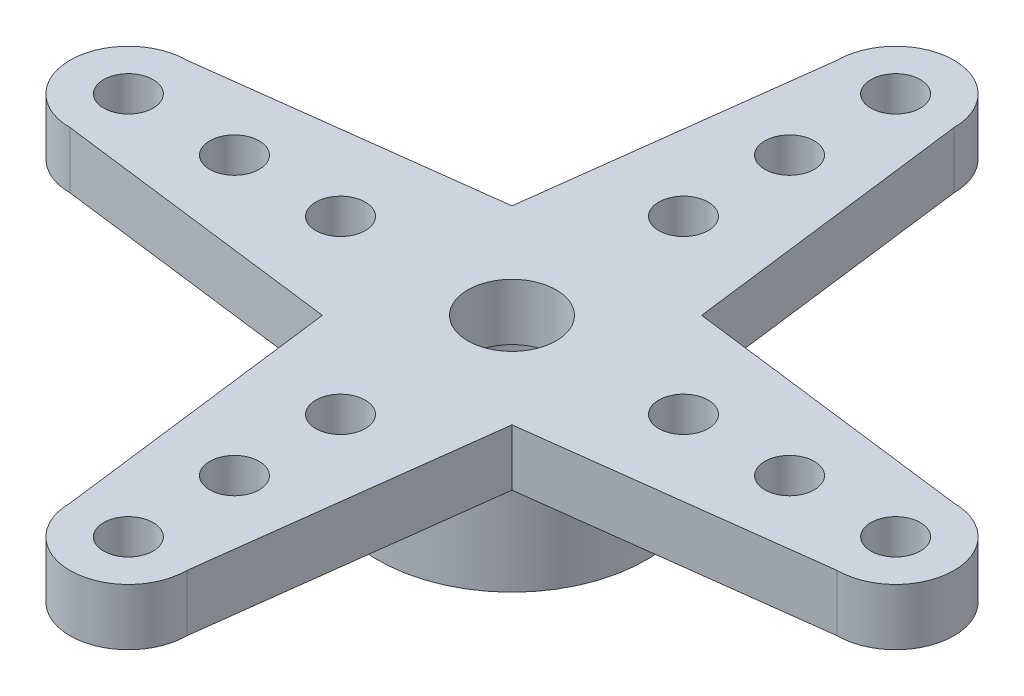
ISO-10303-21;
HEADER;
FILE_DESCRIPTION(('STEP AP214'),'2;1');
FILE_NAME('part.step','',(''),(''),'','','');
FILE_SCHEMA(('AUTOMOTIVE_DESIGN { 1 0 10303 214 1 1 1 1 }'));
ENDSEC;
DATA;
#1=APPLICATION_CONTEXT('core data for automotive mechanical design processes');
#2=APPLICATION_PROTOCOL_DEFINITION('international standard','automotive_design',2000,#1);
#3=PRODUCT_CONTEXT('',#1,'mechanical');
#4=PRODUCT('Part','Part','',(#3));
#5=PRODUCT_RELATED_PRODUCT_CATEGORY('part','',(#4));
#6=PRODUCT_DEFINITION_FORMATION('','',#4);
#7=PRODUCT_DEFINITION_CONTEXT('part definition',#1,'design');
#8=PRODUCT_DEFINITION('design','',#6,#7);
#9=PRODUCT_DEFINITION_SHAPE('','',#8);
#10=(LENGTH_UNIT() NAMED_UNIT(*) SI_UNIT(.MILLI.,.METRE.));
#11=(NAMED_UNIT(*) PLANE_ANGLE_UNIT() SI_UNIT($,.RADIAN.));
#12=(NAMED_UNIT(*) SI_UNIT($,.STERADIAN.) SOLID_ANGLE_UNIT());
#13=UNCERTAINTY_MEASURE_WITH_UNIT(LENGTH_MEASURE(1.E-05),#10,'distance_accuracy_value','');
#14=(GEOMETRIC_REPRESENTATION_CONTEXT(3) GLOBAL_UNCERTAINTY_ASSIGNED_CONTEXT((#13)) GLOBAL_UNIT_ASSIGNED_CONTEXT((#10,
#11,#12)) REPRESENTATION_CONTEXT('',''));
#15=CARTESIAN_POINT('',(0.,0.,0.));
#16=DIRECTION('',(0.,0.,1.));
#17=DIRECTION('',(1.,0.,0.));
#18=AXIS2_PLACEMENT_3D('',#15,#16,#17);
#19=CARTESIAN_POINT('',(-10.849696243319,0.,0.));
#20=DIRECTION('',(0.,-1.,0.));
#21=DIRECTION('',(0.,0.,-1.));
#22=AXIS2_PLACEMENT_3D('',#19,#20,#21);
#23=PLANE('',#22);
#24=CARTESIAN_POINT('',(0.,0.,0.));
#25=DIRECTION('',(0.,-1.,0.));
#26=DIRECTION('',(0.,0.,-1.));
#27=AXIS2_PLACEMENT_3D('',#24,#25,#26);
#28=CIRCLE('',#27,3.79284044463943);
#29=CARTESIAN_POINT('',(2.68194319836314,0.,-2.68194319836314));
#30=VERTEX_POINT('',#29);
#31=CARTESIAN_POINT('',(2.68194319836314,0.,2.68194319836314));
#32=VERTEX_POINT('',#31);
#33=EDGE_CURVE('E54',#30,#32,#28,.T.);
#34=ORIENTED_EDGE('',*,*,#33,.F.);
#35=DIRECTION('',(-0.99211277764572,0.,-0.125348460030807));
#36=VECTOR('',#35,1.);
#37=CARTESIAN_POINT('',(10.8472171800828,0.,-1.65030189467291));
#38=LINE('',#37,#36);
#39=CARTESIAN_POINT('',(10.8472171800828,0.,-1.65030189467291));
#40=VERTEX_POINT('',#39);
#41=EDGE_CURVE('E200',#40,#30,#38,.T.);
#42=ORIENTED_EDGE('',*,*,#41,.F.);
#43=CARTESIAN_POINT('',(10.849696243319,0.,0.));
#44=DIRECTION('',(0.,1.,0.));
#45=DIRECTION('',(0.,0.,1.));
#46=AXIS2_PLACEMENT_3D('',#43,#44,#45);
#47=CIRCLE('',#46,1.65030375668103);
#48=CARTESIAN_POINT('',(10.8472171800828,0.,1.65030189467291));
#49=VERTEX_POINT('',#48);
#50=EDGE_CURVE('E197',#49,#40,#47,.T.);
#51=ORIENTED_EDGE('',*,*,#50,.F.);
#52=DIRECTION('',(0.99211277764572,0.,-0.125348460030806));
#53=VECTOR('',#52,1.);
#54=CARTESIAN_POINT('',(2.68194319836314,0.,2.68194319836314));
#55=LINE('',#54,#53);
#56=EDGE_CURVE('E194',#32,#49,#55,.T.);
#57=ORIENTED_EDGE('',*,*,#56,.F.);
#58=EDGE_LOOP('',(#34,#42,#51,#57));
#59=FACE_BOUND('',#58,.T.);
#60=CARTESIAN_POINT('',(4.84969624331897,0.,0.));
#61=DIRECTION('',(0.,1.,0.));
#62=DIRECTION('',(0.,0.,-1.));
#63=AXIS2_PLACEMENT_3D('',#60,#61,#62);
#64=CIRCLE('',#63,0.7);
#65=CARTESIAN_POINT('',(4.84969624331897,0.,-0.700000000000001));
#66=VERTEX_POINT('',#65);
#67=EDGE_CURVE('E331',#66,#66,#64,.T.);
#68=ORIENTED_EDGE('',*,*,#67,.T.);
#69=EDGE_LOOP('',(#68));
#70=FACE_BOUND('',#69,.T.);
#71=CARTESIAN_POINT('',(10.849696243319,0.,0.));
#72=DIRECTION('',(0.,1.,0.));
#73=DIRECTION('',(0.,0.,-1.));
#74=AXIS2_PLACEMENT_3D('',#71,#72,#73);
#75=CIRCLE('',#74,0.7);
#76=CARTESIAN_POINT('',(10.849696243319,0.,-0.7));
#77=VERTEX_POINT('',#76);
#78=EDGE_CURVE('E363',#77,#77,#75,.T.);
#79=ORIENTED_EDGE('',*,*,#78,.T.);
#80=EDGE_LOOP('',(#79));
#81=FACE_BOUND('',#80,.T.);
#82=CARTESIAN_POINT('',(7.84969624331897,0.,0.));
#83=DIRECTION('',(0.,1.,0.));
#84=DIRECTION('',(0.,0.,-1.));
#85=AXIS2_PLACEMENT_3D('',#82,#83,#84);
#86=CIRCLE('',#85,0.7);
#87=CARTESIAN_POINT('',(7.84969624331897,0.,-0.700000000000001));
#88=VERTEX_POINT('',#87);
#89=EDGE_CURVE('E325',#88,#88,#86,.T.);
#90=ORIENTED_EDGE('',*,*,#89,.T.);
#91=EDGE_LOOP('',(#90));
#92=FACE_BOUND('',#91,.T.);
#93=ADVANCED_FACE('F41',(#59,#70,#81,#92),#23,.T.);
#94=CARTESIAN_POINT('',(-2.68194319836314,0.,2.68194319836314));
#95=VERTEX_POINT('',#94);
#96=EDGE_CURVE('E11',#32,#95,#28,.T.);
#97=ORIENTED_EDGE('',*,*,#96,.F.);
#98=DIRECTION('',(0.125348460030806,0.,-0.99211277764572));
#99=VECTOR('',#98,1.);
#100=CARTESIAN_POINT('',(1.65030189467291,0.,10.8472171800828));
#101=LINE('',#100,#99);
#102=CARTESIAN_POINT('',(1.65030189467291,0.,10.8472171800828));
#103=VERTEX_POINT('',#102);
#104=EDGE_CURVE('E190',#103,#32,#101,.T.);
#105=ORIENTED_EDGE('',*,*,#104,.F.);
#106=CARTESIAN_POINT('',(0.,0.,10.849696243319));
#107=DIRECTION('',(0.,1.,0.));
#108=DIRECTION('',(0.,0.,1.));
#109=AXIS2_PLACEMENT_3D('',#106,#107,#108);
#110=CIRCLE('',#109,1.65030375668103);
#111=CARTESIAN_POINT('',(-1.65030189467291,0.,10.8472171800828));
#112=VERTEX_POINT('',#111);
#113=EDGE_CURVE('E187',#112,#103,#110,.T.);
#114=ORIENTED_EDGE('',*,*,#113,.F.);
#115=DIRECTION('',(0.125348460030806,0.,0.99211277764572));
#116=VECTOR('',#115,1.);
#117=CARTESIAN_POINT('',(-2.68194319836314,0.,2.68194319836314));
#118=LINE('',#117,#116);
#119=EDGE_CURVE('E184',#95,#112,#118,.T.);
#120=ORIENTED_EDGE('',*,*,#119,.F.);
#121=EDGE_LOOP('',(#97,#105,#114,#120));
#122=FACE_BOUND('',#121,.T.);
#123=CARTESIAN_POINT('',(0.,0.,7.84969624331897));
#124=DIRECTION('',(0.,1.,0.));
#125=DIRECTION('',(0.,0.,-1.));
#126=AXIS2_PLACEMENT_3D('',#123,#124,#125);
#127=CIRCLE('',#126,0.7);
#128=CARTESIAN_POINT('',(0.,0.,7.14969624331897));
#129=VERTEX_POINT('',#128);
#130=EDGE_CURVE('E387',#129,#129,#127,.T.);
#131=ORIENTED_EDGE('',*,*,#130,.T.);
#132=EDGE_LOOP('',(#131));
#133=FACE_BOUND('',#132,.T.);
#134=CARTESIAN_POINT('',(0.,0.,4.84969624331897));
#135=DIRECTION('',(0.,1.,0.));
#136=DIRECTION('',(0.,0.,-1.));
#137=AXIS2_PLACEMENT_3D('',#134,#135,#136);
#138=CIRCLE('',#137,0.7);
#139=CARTESIAN_POINT('',(0.,0.,4.14969624331897));
#140=VERTEX_POINT('',#139);
#141=EDGE_CURVE('E395',#140,#140,#138,.T.);
#142=ORIENTED_EDGE('',*,*,#141,.T.);
#143=EDGE_LOOP('',(#142));
#144=FACE_BOUND('',#143,.T.);
#145=CARTESIAN_POINT('',(0.,0.,10.849696243319));
#146=DIRECTION('',(0.,1.,0.));
#147=DIRECTION('',(0.,0.,-1.));
#148=AXIS2_PLACEMENT_3D('',#145,#146,#147);
#149=CIRCLE('',#148,0.7);
#150=CARTESIAN_POINT('',(0.,0.,10.149696243319));
#151=VERTEX_POINT('',#150);
#152=EDGE_CURVE('E379',#151,#151,#149,.T.);
#153=ORIENTED_EDGE('',*,*,#152,.T.);
#154=EDGE_LOOP('',(#153));
#155=FACE_BOUND('',#154,.T.);
#156=ADVANCED_FACE('F291',(#122,#133,#144,#155),#23,.T.);
#157=CARTESIAN_POINT('',(-2.68194319836314,0.,-2.68194319836314));
#158=VERTEX_POINT('',#157);
#159=EDGE_CURVE('E52',#95,#158,#28,.T.);
#160=ORIENTED_EDGE('',*,*,#159,.F.);
#161=DIRECTION('',(0.99211277764572,0.,0.125348460030806));
#162=VECTOR('',#161,1.);
#163=CARTESIAN_POINT('',(-10.8472171800828,0.,1.65030189467291));
#164=LINE('',#163,#162);
#165=CARTESIAN_POINT('',(-10.8472171800828,0.,1.65030189467291));
#166=VERTEX_POINT('',#165);
#167=EDGE_CURVE('E179',#166,#95,#164,.T.);
#168=ORIENTED_EDGE('',*,*,#167,.F.);
#169=CARTESIAN_POINT('',(-10.849696243319,0.,0.));
#170=DIRECTION('',(0.,1.,0.));
#171=DIRECTION('',(0.,0.,-1.));
#172=AXIS2_PLACEMENT_3D('',#169,#170,#171);
#173=CIRCLE('',#172,1.65030375668103);
#174=CARTESIAN_POINT('',(-10.8472171800828,0.,-1.65030189467291));
#175=VERTEX_POINT('',#174);
#176=EDGE_CURVE('E175',#175,#166,#173,.T.);
#177=ORIENTED_EDGE('',*,*,#176,.F.);
#178=DIRECTION('',(-0.99211277764572,0.,0.125348460030806));
#179=VECTOR('',#178,1.);
#180=CARTESIAN_POINT('',(-2.68194319836314,0.,-2.68194319836314));
#181=LINE('',#180,#179);
#182=EDGE_CURVE('E108',#158,#175,#181,.T.);
#183=ORIENTED_EDGE('',*,*,#182,.F.);
#184=EDGE_LOOP('',(#160,#168,#177,#183));
#185=FACE_BOUND('',#184,.T.);
#186=CARTESIAN_POINT('',(-7.84969624331897,0.,0.));
#187=DIRECTION('',(0.,1.,0.));
#188=DIRECTION('',(0.,0.,1.));
#189=AXIS2_PLACEMENT_3D('',#186,#187,#188);
#190=CIRCLE('',#189,0.699999999999999);
#191=CARTESIAN_POINT('',(-7.84969624331897,0.,0.699999999999998));
#192=VERTEX_POINT('',#191);
#193=EDGE_CURVE('E347',#192,#192,#190,.T.);
#194=ORIENTED_EDGE('',*,*,#193,.T.);
#195=EDGE_LOOP('',(#194));
#196=FACE_BOUND('',#195,.T.);
#197=CARTESIAN_POINT('',(-10.849696243319,0.,0.));
#198=DIRECTION('',(0.,1.,0.));
#199=DIRECTION('',(0.,0.,1.));
#200=AXIS2_PLACEMENT_3D('',#197,#198,#199);
#201=CIRCLE('',#200,0.7);
#202=CARTESIAN_POINT('',(-10.849696243319,0.,0.699999999999999));
#203=VERTEX_POINT('',#202);
#204=EDGE_CURVE('E371',#203,#203,#201,.T.);
#205=ORIENTED_EDGE('',*,*,#204,.T.);
#206=EDGE_LOOP('',(#205));
#207=FACE_BOUND('',#206,.T.);
#208=CARTESIAN_POINT('',(-4.84969624331897,0.,0.));
#209=DIRECTION('',(0.,1.,0.));
#210=DIRECTION('',(0.,0.,1.));
#211=AXIS2_PLACEMENT_3D('',#208,#209,#210);
#212=CIRCLE('',#211,0.7);
#213=CARTESIAN_POINT('',(-4.84969624331897,0.,0.699999999999998));
#214=VERTEX_POINT('',#213);
#215=EDGE_CURVE('E339',#214,#214,#212,.T.);
#216=ORIENTED_EDGE('',*,*,#215,.T.);
#217=EDGE_LOOP('',(#216));
#218=FACE_BOUND('',#217,.T.);
#219=ADVANCED_FACE('F298',(#185,#196,#207,#218),#23,.T.);
#220=CARTESIAN_POINT('',(0.,0.,0.));
#221=DIRECTION('',(0.,1.,0.));
#222=DIRECTION('',(0.,0.,1.));
#223=AXIS2_PLACEMENT_3D('',#220,#221,#222);
#224=CIRCLE('',#223,1.25);
#225=CARTESIAN_POINT('',(0.,0.,1.25));
#226=VERTEX_POINT('',#225);
#227=EDGE_CURVE('E266',#226,#226,#224,.T.);
#228=ORIENTED_EDGE('',*,*,#227,.T.);
#229=EDGE_LOOP('',(#228));
#230=FACE_BOUND('',#229,.T.);
#231=CARTESIAN_POINT('',(0.,0.,0.));
#232=DIRECTION('',(0.,-1.,0.));
#233=DIRECTION('',(0.,0.,-1.));
#234=AXIS2_PLACEMENT_3D('',#231,#232,#233);
#235=CIRCLE('',#234,2.43);
#236=CARTESIAN_POINT('',(0.,0.,-2.43));
#237=VERTEX_POINT('',#236);
#238=EDGE_CURVE('E268',#237,#237,#235,.T.);
#239=ORIENTED_EDGE('',*,*,#238,.T.);
#240=EDGE_LOOP('',(#239));
#241=FACE_BOUND('',#240,.T.);
#242=ADVANCED_FACE('F277',(#230,#241),#23,.T.);
#243=CARTESIAN_POINT('',(-10.849696243319,1.6,0.));
#244=DIRECTION('',(0.,-1.,0.));
#245=DIRECTION('',(0.,0.,-1.));
#246=AXIS2_PLACEMENT_3D('',#243,#244,#245);
#247=PLANE('',#246);
#248=CARTESIAN_POINT('',(-10.849696243319,1.6,0.));
#249=DIRECTION('',(0.,1.,0.));
#250=DIRECTION('',(0.,0.,-1.));
#251=AXIS2_PLACEMENT_3D('',#248,#249,#250);
#252=CIRCLE('',#251,1.65030375668103);
#253=CARTESIAN_POINT('',(-10.8472171800828,1.6,-1.65030189467291));
#254=VERTEX_POINT('',#253);
#255=CARTESIAN_POINT('',(-10.8472171800828,1.6,1.65030189467291));
#256=VERTEX_POINT('',#255);
#257=EDGE_CURVE('E214',#254,#256,#252,.T.);
#258=ORIENTED_EDGE('',*,*,#257,.T.);
#259=DIRECTION('',(0.99211277764572,0.,0.125348460030806));
#260=VECTOR('',#259,1.);
#261=CARTESIAN_POINT('',(-10.8472171800828,1.6,1.65030189467291));
#262=LINE('',#261,#260);
#263=CARTESIAN_POINT('',(-2.68194319836314,1.6,2.68194319836314));
#264=VERTEX_POINT('',#263);
#265=EDGE_CURVE('E117',#256,#264,#262,.T.);
#266=ORIENTED_EDGE('',*,*,#265,.T.);
#267=DIRECTION('',(0.125348460030806,0.,0.99211277764572));
#268=VECTOR('',#267,1.);
#269=CARTESIAN_POINT('',(-2.68194319836314,1.6,2.68194319836314));
#270=LINE('',#269,#268);
#271=CARTESIAN_POINT('',(-1.65030189467291,1.6,10.8472171800828));
#272=VERTEX_POINT('',#271);
#273=EDGE_CURVE('E425',#264,#272,#270,.T.);
#274=ORIENTED_EDGE('',*,*,#273,.T.);
#275=CARTESIAN_POINT('',(0.,1.6,10.849696243319));
#276=DIRECTION('',(0.,1.,0.));
#277=DIRECTION('',(0.,0.,1.));
#278=AXIS2_PLACEMENT_3D('',#275,#276,#277);
#279=CIRCLE('',#278,1.65030375668103);
#280=CARTESIAN_POINT('',(1.65030189467291,1.6,10.8472171800828));
#281=VERTEX_POINT('',#280);
#282=EDGE_CURVE('E428',#272,#281,#279,.T.);
#283=ORIENTED_EDGE('',*,*,#282,.T.);
#284=DIRECTION('',(0.125348460030806,0.,-0.99211277764572));
#285=VECTOR('',#284,1.);
#286=CARTESIAN_POINT('',(1.65030189467291,1.6,10.8472171800828));
#287=LINE('',#286,#285);
#288=CARTESIAN_POINT('',(2.68194319836314,1.6,2.68194319836314));
#289=VERTEX_POINT('',#288);
#290=EDGE_CURVE('E431',#281,#289,#287,.T.);
#291=ORIENTED_EDGE('',*,*,#290,.T.);
#292=DIRECTION('',(0.99211277764572,0.,-0.125348460030806));
#293=VECTOR('',#292,1.);
#294=CARTESIAN_POINT('',(2.68194319836314,1.6,2.68194319836314));
#295=LINE('',#294,#293);
#296=CARTESIAN_POINT('',(10.8472171800828,1.6,1.65030189467291));
#297=VERTEX_POINT('',#296);
#298=EDGE_CURVE('E434',#289,#297,#295,.T.);
#299=ORIENTED_EDGE('',*,*,#298,.T.);
#300=CARTESIAN_POINT('',(10.849696243319,1.6,0.));
#301=DIRECTION('',(0.,1.,0.));
#302=DIRECTION('',(0.,0.,1.));
#303=AXIS2_PLACEMENT_3D('',#300,#301,#302);
#304=CIRCLE('',#303,1.65030375668103);
#305=CARTESIAN_POINT('',(10.8472171800828,1.6,-1.65030189467291));
#306=VERTEX_POINT('',#305);
#307=EDGE_CURVE('E437',#297,#306,#304,.T.);
#308=ORIENTED_EDGE('',*,*,#307,.T.);
#309=DIRECTION('',(-0.99211277764572,0.,-0.125348460030807));
#310=VECTOR('',#309,1.);
#311=CARTESIAN_POINT('',(10.8472171800828,1.6,-1.65030189467291));
#312=LINE('',#311,#310);
#313=CARTESIAN_POINT('',(2.68194319836314,1.6,-2.68194319836314));
#314=VERTEX_POINT('',#313);
#315=EDGE_CURVE('E440',#306,#314,#312,.T.);
#316=ORIENTED_EDGE('',*,*,#315,.T.);
#317=DIRECTION('',(-0.125348460030806,0.,-0.99211277764572));
#318=VECTOR('',#317,1.);
#319=CARTESIAN_POINT('',(2.68194319836314,1.6,-2.68194319836314));
#320=LINE('',#319,#318);
#321=CARTESIAN_POINT('',(1.65030189467291,1.6,-10.8472171800828));
#322=VERTEX_POINT('',#321);
#323=EDGE_CURVE('E151',#314,#322,#320,.T.);
#324=ORIENTED_EDGE('',*,*,#323,.T.);
#325=CARTESIAN_POINT('',(0.,1.6,-10.849696243319));
#326=DIRECTION('',(0.,1.,0.));
#327=DIRECTION('',(0.,0.,-1.));
#328=AXIS2_PLACEMENT_3D('',#325,#326,#327);
#329=CIRCLE('',#328,1.65030375668103);
#330=CARTESIAN_POINT('',(-1.65030189467291,1.6,-10.8472171800828));
#331=VERTEX_POINT('',#330);
#332=EDGE_CURVE('E143',#322,#331,#329,.T.);
#333=ORIENTED_EDGE('',*,*,#332,.T.);
#334=DIRECTION('',(-0.125348460030806,0.,0.99211277764572));
#335=VECTOR('',#334,1.);
#336=CARTESIAN_POINT('',(-1.65030189467291,1.6,-10.8472171800828));
#337=LINE('',#336,#335);
#338=CARTESIAN_POINT('',(-2.68194319836314,1.6,-2.68194319836314));
#339=VERTEX_POINT('',#338);
#340=EDGE_CURVE('E148',#331,#339,#337,.T.);
#341=ORIENTED_EDGE('',*,*,#340,.T.);
#342=DIRECTION('',(-0.99211277764572,0.,0.125348460030806));
#343=VECTOR('',#342,1.);
#344=CARTESIAN_POINT('',(-2.68194319836314,1.6,-2.68194319836314));
#345=LINE('',#344,#343);
#346=EDGE_CURVE('E62',#339,#254,#345,.T.);
#347=ORIENTED_EDGE('',*,*,#346,.T.);
#348=EDGE_LOOP('',(#258,#266,#274,#283,#291,#299,#308,#316,#324,#333,#341,#347));
#349=FACE_BOUND('',#348,.T.);
#350=CARTESIAN_POINT('',(0.,1.6,-7.84969624331897));
#351=DIRECTION('',(0.,1.,0.));
#352=DIRECTION('',(0.,0.,1.));
#353=AXIS2_PLACEMENT_3D('',#350,#351,#352);
#354=CIRCLE('',#353,0.7);
#355=CARTESIAN_POINT('',(0.,1.6,-7.14969624331897));
#356=VERTEX_POINT('',#355);
#357=EDGE_CURVE('E180',#356,#356,#354,.T.);
#358=ORIENTED_EDGE('',*,*,#357,.F.);
#359=EDGE_LOOP('',(#358));
#360=FACE_BOUND('',#359,.T.);
#361=CARTESIAN_POINT('',(0.,1.6,-10.849696243319));
#362=DIRECTION('',(0.,1.,0.));
#363=DIRECTION('',(0.,0.,1.));
#364=AXIS2_PLACEMENT_3D('',#361,#362,#363);
#365=CIRCLE('',#364,0.7);
#366=CARTESIAN_POINT('',(0.,1.6,-10.149696243319));
#367=VERTEX_POINT('',#366);
#368=EDGE_CURVE('E407',#367,#367,#365,.T.);
#369=ORIENTED_EDGE('',*,*,#368,.F.);
#370=EDGE_LOOP('',(#369));
#371=FACE_BOUND('',#370,.T.);
#372=CARTESIAN_POINT('',(0.,1.6,4.84969624331897));
#373=DIRECTION('',(0.,1.,0.));
#374=DIRECTION('',(0.,0.,-1.));
#375=AXIS2_PLACEMENT_3D('',#372,#373,#374);
#376=CIRCLE('',#375,0.7);
#377=CARTESIAN_POINT('',(0.,1.6,4.14969624331897));
#378=VERTEX_POINT('',#377);
#379=EDGE_CURVE('E399',#378,#378,#376,.T.);
#380=ORIENTED_EDGE('',*,*,#379,.F.);
#381=EDGE_LOOP('',(#380));
#382=FACE_BOUND('',#381,.T.);
#383=CARTESIAN_POINT('',(0.,1.6,7.84969624331897));
#384=DIRECTION('',(0.,1.,0.));
#385=DIRECTION('',(0.,0.,-1.));
#386=AXIS2_PLACEMENT_3D('',#383,#384,#385);
#387=CIRCLE('',#386,0.7);
#388=CARTESIAN_POINT('',(0.,1.6,7.14969624331897));
#389=VERTEX_POINT('',#388);
#390=EDGE_CURVE('E391',#389,#389,#387,.T.);
#391=ORIENTED_EDGE('',*,*,#390,.F.);
#392=EDGE_LOOP('',(#391));
#393=FACE_BOUND('',#392,.T.);
#394=CARTESIAN_POINT('',(0.,1.6,10.849696243319));
#395=DIRECTION('',(0.,1.,0.));
#396=DIRECTION('',(0.,0.,-1.));
#397=AXIS2_PLACEMENT_3D('',#394,#395,#396);
#398=CIRCLE('',#397,0.7);
#399=CARTESIAN_POINT('',(0.,1.6,10.149696243319));
#400=VERTEX_POINT('',#399);
#401=EDGE_CURVE('E383',#400,#400,#398,.T.);
#402=ORIENTED_EDGE('',*,*,#401,.F.);
#403=EDGE_LOOP('',(#402));
#404=FACE_BOUND('',#403,.T.);
#405=CARTESIAN_POINT('',(-10.849696243319,1.6,0.));
#406=DIRECTION('',(0.,1.,0.));
#407=DIRECTION('',(0.,0.,1.));
#408=AXIS2_PLACEMENT_3D('',#405,#406,#407);
#409=CIRCLE('',#408,0.7);
#410=CARTESIAN_POINT('',(-10.849696243319,1.6,0.699999999999999));
#411=VERTEX_POINT('',#410);
#412=EDGE_CURVE('E375',#411,#411,#409,.T.);
#413=ORIENTED_EDGE('',*,*,#412,.F.);
#414=EDGE_LOOP('',(#413));
#415=FACE_BOUND('',#414,.T.);
#416=CARTESIAN_POINT('',(10.849696243319,1.6,0.));
#417=DIRECTION('',(0.,1.,0.));
#418=DIRECTION('',(0.,0.,-1.));
#419=AXIS2_PLACEMENT_3D('',#416,#417,#418);
#420=CIRCLE('',#419,0.7);
#421=CARTESIAN_POINT('',(10.849696243319,1.6,-0.7));
#422=VERTEX_POINT('',#421);
#423=EDGE_CURVE('E367',#422,#422,#420,.T.);
#424=ORIENTED_EDGE('',*,*,#423,.F.);
#425=EDGE_LOOP('',(#424));
#426=FACE_BOUND('',#425,.T.);
#427=CARTESIAN_POINT('',(0.,1.6,-4.84969624331897));
#428=DIRECTION('',(0.,1.,0.));
#429=DIRECTION('',(0.,0.,1.));
#430=AXIS2_PLACEMENT_3D('',#427,#428,#429);
#431=CIRCLE('',#430,0.7);
#432=CARTESIAN_POINT('',(0.,1.6,-4.14969624331897));
#433=VERTEX_POINT('',#432);
#434=EDGE_CURVE('E359',#433,#433,#431,.T.);
#435=ORIENTED_EDGE('',*,*,#434,.F.);
#436=EDGE_LOOP('',(#435));
#437=FACE_BOUND('',#436,.T.);
#438=CARTESIAN_POINT('',(-7.84969624331897,1.6,0.));
#439=DIRECTION('',(0.,1.,0.));
#440=DIRECTION('',(0.,0.,1.));
#441=AXIS2_PLACEMENT_3D('',#438,#439,#440);
#442=CIRCLE('',#441,0.699999999999999);
#443=CARTESIAN_POINT('',(-7.84969624331897,1.6,0.699999999999998));
#444=VERTEX_POINT('',#443);
#445=EDGE_CURVE('E351',#444,#444,#442,.T.);
#446=ORIENTED_EDGE('',*,*,#445,.F.);
#447=EDGE_LOOP('',(#446));
#448=FACE_BOUND('',#447,.T.);
#449=CARTESIAN_POINT('',(-4.84969624331897,1.6,0.));
#450=DIRECTION('',(0.,1.,0.));
#451=DIRECTION('',(0.,0.,1.));
#452=AXIS2_PLACEMENT_3D('',#449,#450,#451);
#453=CIRCLE('',#452,0.7);
#454=CARTESIAN_POINT('',(-4.84969624331897,1.6,0.699999999999998));
#455=VERTEX_POINT('',#454);
#456=EDGE_CURVE('E343',#455,#455,#453,.T.);
#457=ORIENTED_EDGE('',*,*,#456,.F.);
#458=EDGE_LOOP('',(#457));
#459=FACE_BOUND('',#458,.T.);
#460=CARTESIAN_POINT('',(4.84969624331897,1.6,0.));
#461=DIRECTION('',(0.,1.,0.));
#462=DIRECTION('',(0.,0.,-1.));
#463=AXIS2_PLACEMENT_3D('',#460,#461,#462);
#464=CIRCLE('',#463,0.7);
#465=CARTESIAN_POINT('',(4.84969624331897,1.6,-0.700000000000001));
#466=VERTEX_POINT('',#465);
#467=EDGE_CURVE('E335',#466,#466,#464,.T.);
#468=ORIENTED_EDGE('',*,*,#467,.F.);
#469=EDGE_LOOP('',(#468));
#470=FACE_BOUND('',#469,.T.);
#471=CARTESIAN_POINT('',(7.84969624331897,1.6,0.));
#472=DIRECTION('',(0.,1.,0.));
#473=DIRECTION('',(0.,0.,-1.));
#474=AXIS2_PLACEMENT_3D('',#471,#472,#473);
#475=CIRCLE('',#474,0.7);
#476=CARTESIAN_POINT('',(7.84969624331897,1.6,-0.700000000000001));
#477=VERTEX_POINT('',#476);
#478=EDGE_CURVE('E327',#477,#477,#475,.T.);
#479=ORIENTED_EDGE('',*,*,#478,.F.);
#480=EDGE_LOOP('',(#479));
#481=FACE_BOUND('',#480,.T.);
#482=CARTESIAN_POINT('',(0.,1.6,0.));
#483=DIRECTION('',(0.,1.,0.));
#484=DIRECTION('',(0.,0.,1.));
#485=AXIS2_PLACEMENT_3D('',#482,#483,#484);
#486=CIRCLE('',#485,1.25);
#487=CARTESIAN_POINT('',(0.,1.6,1.25));
#488=VERTEX_POINT('',#487);
#489=EDGE_CURVE('E321',#488,#488,#486,.T.);
#490=ORIENTED_EDGE('',*,*,#489,.F.);
#491=EDGE_LOOP('',(#490));
#492=FACE_BOUND('',#491,.T.);
#493=ADVANCED_FACE('F145',(#349,#360,#371,#382,#393,#404,#415,#426,#437,#448,#459,#470,#481,
#492),#247,.F.);
#494=EDGE_CURVE('E101',#158,#30,#28,.T.);
#495=ORIENTED_EDGE('',*,*,#494,.F.);
#496=DIRECTION('',(-0.125348460030806,0.,0.99211277764572));
#497=VECTOR('',#496,1.);
#498=CARTESIAN_POINT('',(-1.65030189467291,0.,-10.8472171800828));
#499=LINE('',#498,#497);
#500=CARTESIAN_POINT('',(-1.65030189467291,0.,-10.8472171800828));
#501=VERTEX_POINT('',#500);
#502=EDGE_CURVE('E209',#501,#158,#499,.T.);
#503=ORIENTED_EDGE('',*,*,#502,.F.);
#504=CARTESIAN_POINT('',(0.,0.,-10.849696243319));
#505=DIRECTION('',(0.,1.,0.));
#506=DIRECTION('',(0.,0.,-1.));
#507=AXIS2_PLACEMENT_3D('',#504,#505,#506);
#508=CIRCLE('',#507,1.65030375668103);
#509=CARTESIAN_POINT('',(1.65030189467291,0.,-10.8472171800828));
#510=VERTEX_POINT('',#509);
#511=EDGE_CURVE('E161',#510,#501,#508,.T.);
#512=ORIENTED_EDGE('',*,*,#511,.F.);
#513=DIRECTION('',(-0.125348460030806,0.,-0.99211277764572));
#514=VECTOR('',#513,1.);
#515=CARTESIAN_POINT('',(2.68194319836314,0.,-2.68194319836314));
#516=LINE('',#515,#514);
#517=EDGE_CURVE('E204',#30,#510,#516,.T.);
#518=ORIENTED_EDGE('',*,*,#517,.F.);
#519=EDGE_LOOP('',(#495,#503,#512,#518));
#520=FACE_BOUND('',#519,.T.);
#521=CARTESIAN_POINT('',(0.,0.,-4.84969624331897));
#522=DIRECTION('',(0.,1.,0.));
#523=DIRECTION('',(0.,0.,1.));
#524=AXIS2_PLACEMENT_3D('',#521,#522,#523);
#525=CIRCLE('',#524,0.7);
#526=CARTESIAN_POINT('',(0.,0.,-4.14969624331897));
#527=VERTEX_POINT('',#526);
#528=EDGE_CURVE('E355',#527,#527,#525,.T.);
#529=ORIENTED_EDGE('',*,*,#528,.T.);
#530=EDGE_LOOP('',(#529));
#531=FACE_BOUND('',#530,.T.);
#532=CARTESIAN_POINT('',(0.,0.,-10.849696243319));
#533=DIRECTION('',(0.,1.,0.));
#534=DIRECTION('',(0.,0.,1.));
#535=AXIS2_PLACEMENT_3D('',#532,#533,#534);
#536=CIRCLE('',#535,0.7);
#537=CARTESIAN_POINT('',(0.,0.,-10.149696243319));
#538=VERTEX_POINT('',#537);
#539=EDGE_CURVE('E403',#538,#538,#536,.T.);
#540=ORIENTED_EDGE('',*,*,#539,.T.);
#541=EDGE_LOOP('',(#540));
#542=FACE_BOUND('',#541,.T.);
#543=CARTESIAN_POINT('',(0.,0.,-7.84969624331897));
#544=DIRECTION('',(0.,1.,0.));
#545=DIRECTION('',(0.,0.,1.));
#546=AXIS2_PLACEMENT_3D('',#543,#544,#545);
#547=CIRCLE('',#546,0.7);
#548=CARTESIAN_POINT('',(0.,0.,-7.14969624331897));
#549=VERTEX_POINT('',#548);
#550=EDGE_CURVE('E411',#549,#549,#547,.T.);
#551=ORIENTED_EDGE('',*,*,#550,.T.);
#552=EDGE_LOOP('',(#551));
#553=FACE_BOUND('',#552,.T.);
#554=ADVANCED_FACE('F294',(#520,#531,#542,#553),#23,.T.);
#555=CARTESIAN_POINT('',(-10.849696243319,1.6,0.));
#556=DIRECTION('',(0.,-1.,0.));
#557=DIRECTION('',(0.,0.,-1.));
#558=AXIS2_PLACEMENT_3D('',#555,#556,#557);
#559=CYLINDRICAL_SURFACE('',#558,1.65030375668103);
#560=ORIENTED_EDGE('',*,*,#176,.T.);
#561=DIRECTION('',(0.,-1.,0.));
#562=VECTOR('',#561,1.);
#563=CARTESIAN_POINT('',(-10.8472171800828,1.6,1.65030189467291));
#564=LINE('',#563,#562);
#565=EDGE_CURVE('E45',#256,#166,#564,.T.);
#566=ORIENTED_EDGE('',*,*,#565,.F.);
#567=ORIENTED_EDGE('',*,*,#257,.F.);
#568=DIRECTION('',(0.,-1.,0.));
#569=VECTOR('',#568,1.);
#570=CARTESIAN_POINT('',(-10.8472171800828,1.6,-1.65030189467291));
#571=LINE('',#570,#569);
#572=EDGE_CURVE('E171',#254,#175,#571,.T.);
#573=ORIENTED_EDGE('',*,*,#572,.T.);
#574=EDGE_LOOP('',(#560,#566,#567,#573));
#575=FACE_BOUND('',#574,.T.);
#576=ADVANCED_FACE('F43',(#575),#559,.T.);
#577=CARTESIAN_POINT('',(-10.8472171800828,1.6,1.65030189467291));
#578=DIRECTION('',(0.125348460030806,0.,-0.99211277764572));
#579=DIRECTION('',(-0.99211277764572,0.,-0.125348460030806));
#580=AXIS2_PLACEMENT_3D('',#577,#578,#579);
#581=PLANE('',#580);
#582=ORIENTED_EDGE('',*,*,#167,.T.);
#583=DIRECTION('',(0.,-1.,0.));
#584=VECTOR('',#583,1.);
#585=CARTESIAN_POINT('',(-2.68194319836314,1.6,2.68194319836314));
#586=LINE('',#585,#584);
#587=EDGE_CURVE('E244',#264,#95,#586,.T.);
#588=ORIENTED_EDGE('',*,*,#587,.F.);
#589=ORIENTED_EDGE('',*,*,#265,.F.);
#590=ORIENTED_EDGE('',*,*,#565,.T.);
#591=EDGE_LOOP('',(#582,#588,#589,#590));
#592=FACE_BOUND('',#591,.T.);
#593=ADVANCED_FACE('F308',(#592),#581,.F.);
#594=CARTESIAN_POINT('',(-2.68194319836314,1.6,2.68194319836314));
#595=DIRECTION('',(0.99211277764572,0.,-0.125348460030806));
#596=DIRECTION('',(-0.125348460030806,0.,-0.99211277764572));
#597=AXIS2_PLACEMENT_3D('',#594,#595,#596);
#598=PLANE('',#597);
#599=ORIENTED_EDGE('',*,*,#119,.T.);
#600=DIRECTION('',(0.,-1.,0.));
#601=VECTOR('',#600,1.);
#602=CARTESIAN_POINT('',(-1.65030189467291,1.6,10.8472171800828));
#603=LINE('',#602,#601);
#604=EDGE_CURVE('E241',#272,#112,#603,.T.);
#605=ORIENTED_EDGE('',*,*,#604,.F.);
#606=ORIENTED_EDGE('',*,*,#273,.F.);
#607=ORIENTED_EDGE('',*,*,#587,.T.);
#608=EDGE_LOOP('',(#599,#605,#606,#607));
#609=FACE_BOUND('',#608,.T.);
#610=ADVANCED_FACE('F486',(#609),#598,.F.);
#611=CARTESIAN_POINT('',(0.,1.6,10.849696243319));
#612=DIRECTION('',(0.,-1.,0.));
#613=DIRECTION('',(0.,0.,-1.));
#614=AXIS2_PLACEMENT_3D('',#611,#612,#613);
#615=CYLINDRICAL_SURFACE('',#614,1.65030375668103);
#616=ORIENTED_EDGE('',*,*,#113,.T.);
#617=DIRECTION('',(0.,-1.,0.));
#618=VECTOR('',#617,1.);
#619=CARTESIAN_POINT('',(1.65030189467291,1.6,10.8472171800828));
#620=LINE('',#619,#618);
#621=EDGE_CURVE('E237',#281,#103,#620,.T.);
#622=ORIENTED_EDGE('',*,*,#621,.F.);
#623=ORIENTED_EDGE('',*,*,#282,.F.);
#624=ORIENTED_EDGE('',*,*,#604,.T.);
#625=EDGE_LOOP('',(#616,#622,#623,#624));
#626=FACE_BOUND('',#625,.T.);
#627=ADVANCED_FACE('F483',(#626),#615,.T.);
#628=CARTESIAN_POINT('',(1.65030189467291,1.6,10.8472171800828));
#629=DIRECTION('',(-0.99211277764572,0.,-0.125348460030806));
#630=DIRECTION('',(-0.125348460030806,0.,0.99211277764572));
#631=AXIS2_PLACEMENT_3D('',#628,#629,#630);
#632=PLANE('',#631);
#633=ORIENTED_EDGE('',*,*,#104,.T.);
#634=DIRECTION('',(0.,-1.,0.));
#635=VECTOR('',#634,1.);
#636=CARTESIAN_POINT('',(2.68194319836314,1.6,2.68194319836314));
#637=LINE('',#636,#635);
#638=EDGE_CURVE('E233',#289,#32,#637,.T.);
#639=ORIENTED_EDGE('',*,*,#638,.F.);
#640=ORIENTED_EDGE('',*,*,#290,.F.);
#641=ORIENTED_EDGE('',*,*,#621,.T.);
#642=EDGE_LOOP('',(#633,#639,#640,#641));
#643=FACE_BOUND('',#642,.T.);
#644=ADVANCED_FACE('F460',(#643),#632,.F.);
#645=CARTESIAN_POINT('',(2.68194319836314,1.6,2.68194319836314));
#646=DIRECTION('',(-0.125348460030806,0.,-0.99211277764572));
#647=DIRECTION('',(-0.99211277764572,0.,0.125348460030806));
#648=AXIS2_PLACEMENT_3D('',#645,#646,#647);
#649=PLANE('',#648);
#650=ORIENTED_EDGE('',*,*,#56,.T.);
#651=DIRECTION('',(0.,-1.,0.));
#652=VECTOR('',#651,1.);
#653=CARTESIAN_POINT('',(10.8472171800828,1.6,1.65030189467291));
#654=LINE('',#653,#652);
#655=EDGE_CURVE('E229',#297,#49,#654,.T.);
#656=ORIENTED_EDGE('',*,*,#655,.F.);
#657=ORIENTED_EDGE('',*,*,#298,.F.);
#658=ORIENTED_EDGE('',*,*,#638,.T.);
#659=EDGE_LOOP('',(#650,#656,#657,#658));
#660=FACE_BOUND('',#659,.T.);
#661=ADVANCED_FACE('F466',(#660),#649,.F.);
#662=CARTESIAN_POINT('',(10.849696243319,1.6,0.));
#663=DIRECTION('',(0.,-1.,0.));
#664=DIRECTION('',(0.,0.,-1.));
#665=AXIS2_PLACEMENT_3D('',#662,#663,#664);
#666=CYLINDRICAL_SURFACE('',#665,1.65030375668103);
#667=ORIENTED_EDGE('',*,*,#50,.T.);
#668=DIRECTION('',(0.,-1.,0.));
#669=VECTOR('',#668,1.);
#670=CARTESIAN_POINT('',(10.8472171800828,1.6,-1.65030189467291));
#671=LINE('',#670,#669);
#672=EDGE_CURVE('E225',#306,#40,#671,.T.);
#673=ORIENTED_EDGE('',*,*,#672,.F.);
#674=ORIENTED_EDGE('',*,*,#307,.F.);
#675=ORIENTED_EDGE('',*,*,#655,.T.);
#676=EDGE_LOOP('',(#667,#673,#674,#675));
#677=FACE_BOUND('',#676,.T.);
#678=ADVANCED_FACE('F470',(#677),#666,.T.);
#679=CARTESIAN_POINT('',(10.8472171800828,1.6,-1.65030189467291));
#680=DIRECTION('',(-0.125348460030807,0.,0.99211277764572));
#681=DIRECTION('',(0.99211277764572,0.,0.125348460030807));
#682=AXIS2_PLACEMENT_3D('',#679,#680,#681);
#683=PLANE('',#682);
#684=ORIENTED_EDGE('',*,*,#41,.T.);
#685=DIRECTION('',(0.,-1.,0.));
#686=VECTOR('',#685,1.);
#687=CARTESIAN_POINT('',(2.68194319836314,1.6,-2.68194319836314));
#688=LINE('',#687,#686);
#689=EDGE_CURVE('E221',#314,#30,#688,.T.);
#690=ORIENTED_EDGE('',*,*,#689,.F.);
#691=ORIENTED_EDGE('',*,*,#315,.F.);
#692=ORIENTED_EDGE('',*,*,#672,.T.);
#693=EDGE_LOOP('',(#684,#690,#691,#692));
#694=FACE_BOUND('',#693,.T.);
#695=ADVANCED_FACE('F448',(#694),#683,.F.);
#696=CARTESIAN_POINT('',(2.68194319836314,1.6,-2.68194319836314));
#697=DIRECTION('',(-0.99211277764572,0.,0.125348460030806));
#698=DIRECTION('',(0.125348460030806,0.,0.99211277764572));
#699=AXIS2_PLACEMENT_3D('',#696,#697,#698);
#700=PLANE('',#699);
#701=ORIENTED_EDGE('',*,*,#517,.T.);
#702=DIRECTION('',(0.,-1.,0.));
#703=VECTOR('',#702,1.);
#704=CARTESIAN_POINT('',(1.65030189467291,1.6,-10.8472171800828));
#705=LINE('',#704,#703);
#706=EDGE_CURVE('E164',#322,#510,#705,.T.);
#707=ORIENTED_EDGE('',*,*,#706,.F.);
#708=ORIENTED_EDGE('',*,*,#323,.F.);
#709=ORIENTED_EDGE('',*,*,#689,.T.);
#710=EDGE_LOOP('',(#701,#707,#708,#709));
#711=FACE_BOUND('',#710,.T.);
#712=ADVANCED_FACE('F451',(#711),#700,.F.);
#713=CARTESIAN_POINT('',(0.,1.6,-10.849696243319));
#714=DIRECTION('',(0.,-1.,0.));
#715=DIRECTION('',(0.,0.,-1.));
#716=AXIS2_PLACEMENT_3D('',#713,#714,#715);
#717=CYLINDRICAL_SURFACE('',#716,1.65030375668103);
#718=ORIENTED_EDGE('',*,*,#511,.T.);
#719=DIRECTION('',(0.,-1.,0.));
#720=VECTOR('',#719,1.);
#721=CARTESIAN_POINT('',(-1.65030189467291,1.6,-10.8472171800828));
#722=LINE('',#721,#720);
#723=EDGE_CURVE('E158',#331,#501,#722,.T.);
#724=ORIENTED_EDGE('',*,*,#723,.F.);
#725=ORIENTED_EDGE('',*,*,#332,.F.);
#726=ORIENTED_EDGE('',*,*,#706,.T.);
#727=EDGE_LOOP('',(#718,#724,#725,#726));
#728=FACE_BOUND('',#727,.T.);
#729=ADVANCED_FACE('F159',(#728),#717,.T.);
#730=CARTESIAN_POINT('',(-1.65030189467291,1.6,-10.8472171800828));
#731=DIRECTION('',(0.99211277764572,0.,0.125348460030806));
#732=DIRECTION('',(0.125348460030806,0.,-0.99211277764572));
#733=AXIS2_PLACEMENT_3D('',#730,#731,#732);
#734=PLANE('',#733);
#735=ORIENTED_EDGE('',*,*,#502,.T.);
#736=DIRECTION('',(0.,-1.,0.));
#737=VECTOR('',#736,1.);
#738=CARTESIAN_POINT('',(-2.68194319836314,1.6,-2.68194319836314));
#739=LINE('',#738,#737);
#740=EDGE_CURVE('E165',#339,#158,#739,.T.);
#741=ORIENTED_EDGE('',*,*,#740,.F.);
#742=ORIENTED_EDGE('',*,*,#340,.F.);
#743=ORIENTED_EDGE('',*,*,#723,.T.);
#744=EDGE_LOOP('',(#735,#741,#742,#743));
#745=FACE_BOUND('',#744,.T.);
#746=ADVANCED_FACE('F167',(#745),#734,.F.);
#747=CARTESIAN_POINT('',(-2.68194319836314,1.6,-2.68194319836314));
#748=DIRECTION('',(0.125348460030806,0.,0.99211277764572));
#749=DIRECTION('',(0.99211277764572,0.,-0.125348460030806));
#750=AXIS2_PLACEMENT_3D('',#747,#748,#749);
#751=PLANE('',#750);
#752=ORIENTED_EDGE('',*,*,#182,.T.);
#753=ORIENTED_EDGE('',*,*,#572,.F.);
#754=ORIENTED_EDGE('',*,*,#346,.F.);
#755=ORIENTED_EDGE('',*,*,#740,.T.);
#756=EDGE_LOOP('',(#752,#753,#754,#755));
#757=FACE_BOUND('',#756,.T.);
#758=ADVANCED_FACE('F452',(#757),#751,.F.);
#759=CARTESIAN_POINT('',(0.,1.6,-7.84969624331897));
#760=DIRECTION('',(0.,-1.,0.));
#761=DIRECTION('',(0.,0.,-1.));
#762=AXIS2_PLACEMENT_3D('',#759,#760,#761);
#763=CYLINDRICAL_SURFACE('',#762,0.7);
#764=ORIENTED_EDGE('',*,*,#357,.T.);
#765=EDGE_LOOP('',(#764));
#766=FACE_BOUND('',#765,.T.);
#767=ORIENTED_EDGE('',*,*,#550,.F.);
#768=EDGE_LOOP('',(#767));
#769=FACE_BOUND('',#768,.T.);
#770=ADVANCED_FACE('F533',(#766,#769),#763,.F.);
#771=CARTESIAN_POINT('',(0.,1.6,-10.849696243319));
#772=DIRECTION('',(0.,-1.,0.));
#773=DIRECTION('',(0.,0.,-1.));
#774=AXIS2_PLACEMENT_3D('',#771,#772,#773);
#775=CYLINDRICAL_SURFACE('',#774,0.7);
#776=ORIENTED_EDGE('',*,*,#368,.T.);
#777=EDGE_LOOP('',(#776));
#778=FACE_BOUND('',#777,.T.);
#779=ORIENTED_EDGE('',*,*,#539,.F.);
#780=EDGE_LOOP('',(#779));
#781=FACE_BOUND('',#780,.T.);
#782=ADVANCED_FACE('F642',(#778,#781),#775,.F.);
#783=CARTESIAN_POINT('',(0.,1.6,4.84969624331897));
#784=DIRECTION('',(0.,-1.,0.));
#785=DIRECTION('',(0.,0.,-1.));
#786=AXIS2_PLACEMENT_3D('',#783,#784,#785);
#787=CYLINDRICAL_SURFACE('',#786,0.7);
#788=ORIENTED_EDGE('',*,*,#379,.T.);
#789=EDGE_LOOP('',(#788));
#790=FACE_BOUND('',#789,.T.);
#791=ORIENTED_EDGE('',*,*,#141,.F.);
#792=EDGE_LOOP('',(#791));
#793=FACE_BOUND('',#792,.T.);
#794=ADVANCED_FACE('F634',(#790,#793),#787,.F.);
#795=CARTESIAN_POINT('',(0.,1.6,7.84969624331897));
#796=DIRECTION('',(0.,-1.,0.));
#797=DIRECTION('',(0.,0.,-1.));
#798=AXIS2_PLACEMENT_3D('',#795,#796,#797);
#799=CYLINDRICAL_SURFACE('',#798,0.7);
#800=ORIENTED_EDGE('',*,*,#390,.T.);
#801=EDGE_LOOP('',(#800));
#802=FACE_BOUND('',#801,.T.);
#803=ORIENTED_EDGE('',*,*,#130,.F.);
#804=EDGE_LOOP('',(#803));
#805=FACE_BOUND('',#804,.T.);
#806=ADVANCED_FACE('F626',(#802,#805),#799,.F.);
#807=CARTESIAN_POINT('',(0.,1.6,10.849696243319));
#808=DIRECTION('',(0.,-1.,0.));
#809=DIRECTION('',(0.,0.,-1.));
#810=AXIS2_PLACEMENT_3D('',#807,#808,#809);
#811=CYLINDRICAL_SURFACE('',#810,0.7);
#812=ORIENTED_EDGE('',*,*,#401,.T.);
#813=EDGE_LOOP('',(#812));
#814=FACE_BOUND('',#813,.T.);
#815=ORIENTED_EDGE('',*,*,#152,.F.);
#816=EDGE_LOOP('',(#815));
#817=FACE_BOUND('',#816,.T.);
#818=ADVANCED_FACE('F618',(#814,#817),#811,.F.);
#819=CARTESIAN_POINT('',(-10.849696243319,1.6,0.));
#820=DIRECTION('',(0.,-1.,0.));
#821=DIRECTION('',(0.,0.,-1.));
#822=AXIS2_PLACEMENT_3D('',#819,#820,#821);
#823=CYLINDRICAL_SURFACE('',#822,0.7);
#824=ORIENTED_EDGE('',*,*,#412,.T.);
#825=EDGE_LOOP('',(#824));
#826=FACE_BOUND('',#825,.T.);
#827=ORIENTED_EDGE('',*,*,#204,.F.);
#828=EDGE_LOOP('',(#827));
#829=FACE_BOUND('',#828,.T.);
#830=ADVANCED_FACE('F610',(#826,#829),#823,.F.);
#831=CARTESIAN_POINT('',(10.849696243319,1.6,0.));
#832=DIRECTION('',(0.,-1.,0.));
#833=DIRECTION('',(0.,0.,-1.));
#834=AXIS2_PLACEMENT_3D('',#831,#832,#833);
#835=CYLINDRICAL_SURFACE('',#834,0.7);
#836=ORIENTED_EDGE('',*,*,#423,.T.);
#837=EDGE_LOOP('',(#836));
#838=FACE_BOUND('',#837,.T.);
#839=ORIENTED_EDGE('',*,*,#78,.F.);
#840=EDGE_LOOP('',(#839));
#841=FACE_BOUND('',#840,.T.);
#842=ADVANCED_FACE('F602',(#838,#841),#835,.F.);
#843=CARTESIAN_POINT('',(0.,1.6,-4.84969624331897));
#844=DIRECTION('',(0.,-1.,0.));
#845=DIRECTION('',(0.,0.,-1.));
#846=AXIS2_PLACEMENT_3D('',#843,#844,#845);
#847=CYLINDRICAL_SURFACE('',#846,0.7);
#848=ORIENTED_EDGE('',*,*,#434,.T.);
#849=EDGE_LOOP('',(#848));
#850=FACE_BOUND('',#849,.T.);
#851=ORIENTED_EDGE('',*,*,#528,.F.);
#852=EDGE_LOOP('',(#851));
#853=FACE_BOUND('',#852,.T.);
#854=ADVANCED_FACE('F594',(#850,#853),#847,.F.);
#855=CARTESIAN_POINT('',(-7.84969624331897,1.6,0.));
#856=DIRECTION('',(0.,-1.,0.));
#857=DIRECTION('',(0.,0.,-1.));
#858=AXIS2_PLACEMENT_3D('',#855,#856,#857);
#859=CYLINDRICAL_SURFACE('',#858,0.699999999999999);
#860=ORIENTED_EDGE('',*,*,#445,.T.);
#861=EDGE_LOOP('',(#860));
#862=FACE_BOUND('',#861,.T.);
#863=ORIENTED_EDGE('',*,*,#193,.F.);
#864=EDGE_LOOP('',(#863));
#865=FACE_BOUND('',#864,.T.);
#866=ADVANCED_FACE('F586',(#862,#865),#859,.F.);
#867=CARTESIAN_POINT('',(-4.84969624331897,1.6,0.));
#868=DIRECTION('',(0.,-1.,0.));
#869=DIRECTION('',(0.,0.,-1.));
#870=AXIS2_PLACEMENT_3D('',#867,#868,#869);
#871=CYLINDRICAL_SURFACE('',#870,0.7);
#872=ORIENTED_EDGE('',*,*,#456,.T.);
#873=EDGE_LOOP('',(#872));
#874=FACE_BOUND('',#873,.T.);
#875=ORIENTED_EDGE('',*,*,#215,.F.);
#876=EDGE_LOOP('',(#875));
#877=FACE_BOUND('',#876,.T.);
#878=ADVANCED_FACE('F578',(#874,#877),#871,.F.);
#879=CARTESIAN_POINT('',(4.84969624331897,1.6,0.));
#880=DIRECTION('',(0.,-1.,0.));
#881=DIRECTION('',(0.,0.,-1.));
#882=AXIS2_PLACEMENT_3D('',#879,#880,#881);
#883=CYLINDRICAL_SURFACE('',#882,0.7);
#884=ORIENTED_EDGE('',*,*,#467,.T.);
#885=EDGE_LOOP('',(#884));
#886=FACE_BOUND('',#885,.T.);
#887=ORIENTED_EDGE('',*,*,#67,.F.);
#888=EDGE_LOOP('',(#887));
#889=FACE_BOUND('',#888,.T.);
#890=ADVANCED_FACE('F570',(#886,#889),#883,.F.);
#891=CARTESIAN_POINT('',(7.84969624331897,1.6,0.));
#892=DIRECTION('',(0.,-1.,0.));
#893=DIRECTION('',(0.,0.,-1.));
#894=AXIS2_PLACEMENT_3D('',#891,#892,#893);
#895=CYLINDRICAL_SURFACE('',#894,0.7);
#896=ORIENTED_EDGE('',*,*,#478,.T.);
#897=EDGE_LOOP('',(#896));
#898=FACE_BOUND('',#897,.T.);
#899=ORIENTED_EDGE('',*,*,#89,.F.);
#900=EDGE_LOOP('',(#899));
#901=FACE_BOUND('',#900,.T.);
#902=ADVANCED_FACE('F562',(#898,#901),#895,.F.);
#903=CARTESIAN_POINT('',(0.,1.6,0.));
#904=DIRECTION('',(0.,-1.,0.));
#905=DIRECTION('',(0.,0.,-1.));
#906=AXIS2_PLACEMENT_3D('',#903,#904,#905);
#907=CYLINDRICAL_SURFACE('',#906,1.25);
#908=ORIENTED_EDGE('',*,*,#489,.T.);
#909=EDGE_LOOP('',(#908));
#910=FACE_BOUND('',#909,.T.);
#911=ORIENTED_EDGE('',*,*,#227,.F.);
#912=EDGE_LOOP('',(#911));
#913=FACE_BOUND('',#912,.T.);
#914=ADVANCED_FACE('F543',(#910,#913),#907,.F.);
#915=CARTESIAN_POINT('',(0.,-2.5,0.));
#916=DIRECTION('',(0.,-1.,0.));
#917=DIRECTION('',(0.,0.,-1.));
#918=AXIS2_PLACEMENT_3D('',#915,#916,#917);
#919=PLANE('',#918);
#920=CARTESIAN_POINT('',(0.,-2.5,0.));
#921=DIRECTION('',(0.,-1.,0.));
#922=DIRECTION('',(0.,0.,-1.));
#923=AXIS2_PLACEMENT_3D('',#920,#921,#922);
#924=CIRCLE('',#923,3.79284044463943);
#925=CARTESIAN_POINT('',(0.,-2.5,-3.79284044463943));
#926=VERTEX_POINT('',#925);
#927=EDGE_CURVE('E260',#926,#926,#924,.T.);
#928=ORIENTED_EDGE('',*,*,#927,.T.);
#929=EDGE_LOOP('',(#928));
#930=FACE_BOUND('',#929,.T.);
#931=CARTESIAN_POINT('',(0.,-2.5,0.));
#932=DIRECTION('',(0.,-1.,0.));
#933=DIRECTION('',(0.,0.,-1.));
#934=AXIS2_PLACEMENT_3D('',#931,#932,#933);
#935=CIRCLE('',#934,2.43);
#936=CARTESIAN_POINT('',(0.,-2.5,-2.43));
#937=VERTEX_POINT('',#936);
#938=EDGE_CURVE('E261',#937,#937,#935,.T.);
#939=ORIENTED_EDGE('',*,*,#938,.F.);
#940=EDGE_LOOP('',(#939));
#941=FACE_BOUND('',#940,.T.);
#942=ADVANCED_FACE('F286',(#930,#941),#919,.T.);
#943=CARTESIAN_POINT('',(0.,-2.5,0.));
#944=DIRECTION('',(0.,1.,0.));
#945=DIRECTION('',(0.,0.,1.));
#946=AXIS2_PLACEMENT_3D('',#943,#944,#945);
#947=CYLINDRICAL_SURFACE('',#946,3.79284044463943);
#948=ORIENTED_EDGE('',*,*,#927,.F.);
#949=EDGE_LOOP('',(#948));
#950=FACE_BOUND('',#949,.T.);
#951=ORIENTED_EDGE('',*,*,#33,.T.);
#952=ORIENTED_EDGE('',*,*,#96,.T.);
#953=ORIENTED_EDGE('',*,*,#159,.T.);
#954=ORIENTED_EDGE('',*,*,#494,.T.);
#955=EDGE_LOOP('',(#951,#952,#953,#954));
#956=FACE_BOUND('',#955,.T.);
#957=ADVANCED_FACE('F281',(#950,#956),#947,.T.);
#958=CARTESIAN_POINT('',(0.,-2.5,0.));
#959=DIRECTION('',(0.,1.,0.));
#960=DIRECTION('',(0.,0.,1.));
#961=AXIS2_PLACEMENT_3D('',#958,#959,#960);
#962=CYLINDRICAL_SURFACE('',#961,2.43);
#963=ORIENTED_EDGE('',*,*,#938,.T.);
#964=EDGE_LOOP('',(#963));
#965=FACE_BOUND('',#964,.T.);
#966=ORIENTED_EDGE('',*,*,#238,.F.);
#967=EDGE_LOOP('',(#966));
#968=FACE_BOUND('',#967,.T.);
#969=ADVANCED_FACE('F279',(#965,#968),#962,.F.);
#970=CLOSED_SHELL('',(#93,#156,#219,#242,#493,#554,#576,#593,#610,#627,#644,#661,#678,#695,#712,
#729,#746,#758,#770,#782,#794,#806,#818,#830,#842,#854,#866,#878,#890,#902,#914,#942,#957,#969));
#971=MANIFOLD_SOLID_BREP('B2',#970);
#972=ADVANCED_BREP_SHAPE_REPRESENTATION('',(#18,#971),#14);
#973=SHAPE_DEFINITION_REPRESENTATION(#9,#972);
ENDSEC;
END-ISO-10303-21;
